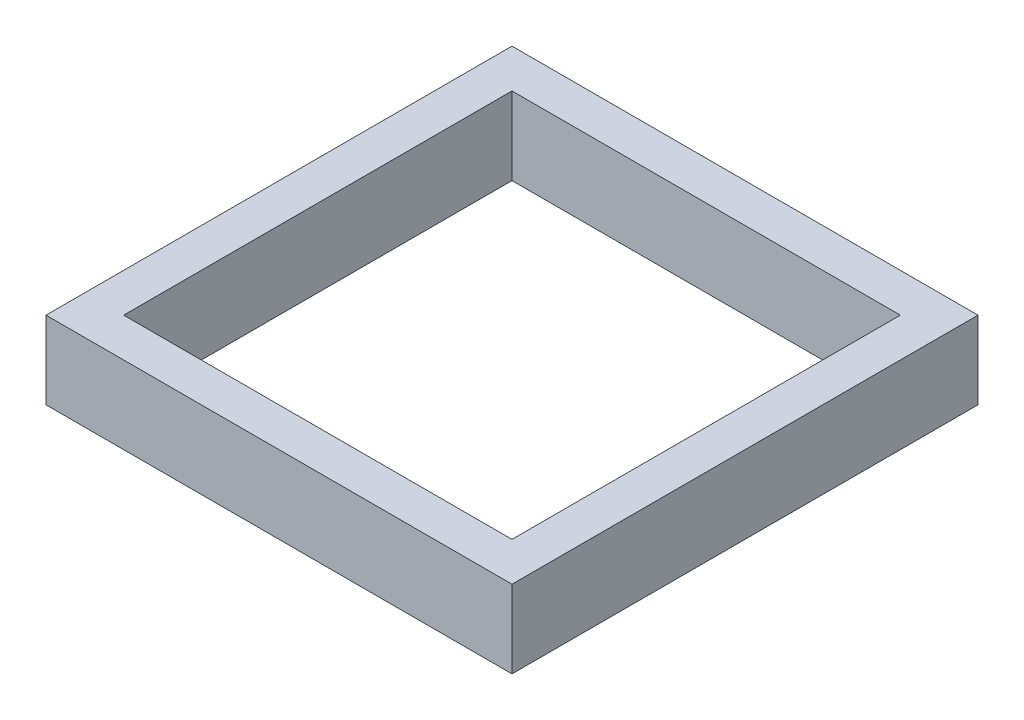
ISO-10303-21;
HEADER;
FILE_DESCRIPTION(('STEP AP214'),'2;1');
FILE_NAME('part.step','',(''),(''),'','','');
FILE_SCHEMA(('AUTOMOTIVE_DESIGN { 1 0 10303 214 1 1 1 1 }'));
ENDSEC;
DATA;
#1=APPLICATION_CONTEXT('core data for automotive mechanical design processes');
#2=APPLICATION_PROTOCOL_DEFINITION('international standard','automotive_design',2000,#1);
#3=PRODUCT_CONTEXT('',#1,'mechanical');
#4=PRODUCT('Part','Part','',(#3));
#5=PRODUCT_RELATED_PRODUCT_CATEGORY('part','',(#4));
#6=PRODUCT_DEFINITION_FORMATION('','',#4);
#7=PRODUCT_DEFINITION_CONTEXT('part definition',#1,'design');
#8=PRODUCT_DEFINITION('design','',#6,#7);
#9=PRODUCT_DEFINITION_SHAPE('','',#8);
#10=(LENGTH_UNIT() NAMED_UNIT(*) SI_UNIT(.MILLI.,.METRE.));
#11=(NAMED_UNIT(*) PLANE_ANGLE_UNIT() SI_UNIT($,.RADIAN.));
#12=(NAMED_UNIT(*) SI_UNIT($,.STERADIAN.) SOLID_ANGLE_UNIT());
#13=UNCERTAINTY_MEASURE_WITH_UNIT(LENGTH_MEASURE(1.E-05),#10,'distance_accuracy_value','');
#14=(GEOMETRIC_REPRESENTATION_CONTEXT(3) GLOBAL_UNCERTAINTY_ASSIGNED_CONTEXT((#13)) GLOBAL_UNIT_ASSIGNED_CONTEXT((#10,
#11,#12)) REPRESENTATION_CONTEXT('',''));
#15=CARTESIAN_POINT('',(0.,0.,0.));
#16=DIRECTION('',(0.,0.,1.));
#17=DIRECTION('',(1.,0.,0.));
#18=AXIS2_PLACEMENT_3D('',#15,#16,#17);
#19=CARTESIAN_POINT('',(-30.,10.,30.));
#20=DIRECTION('',(1.,0.,0.));
#21=DIRECTION('',(0.,0.,-1.));
#22=AXIS2_PLACEMENT_3D('',#19,#20,#21);
#23=PLANE('',#22);
#24=DIRECTION('',(0.,0.,1.));
#25=VECTOR('',#24,1.);
#26=CARTESIAN_POINT('',(-30.,0.,30.));
#27=LINE('',#26,#25);
#28=CARTESIAN_POINT('',(-30.,0.,-30.));
#29=VERTEX_POINT('',#28);
#30=CARTESIAN_POINT('',(-30.,0.,30.));
#31=VERTEX_POINT('',#30);
#32=EDGE_CURVE('E130',#29,#31,#27,.T.);
#33=ORIENTED_EDGE('',*,*,#32,.T.);
#34=DIRECTION('',(0.,-1.,0.));
#35=VECTOR('',#34,1.);
#36=CARTESIAN_POINT('',(-30.,10.,30.));
#37=LINE('',#36,#35);
#38=CARTESIAN_POINT('',(-30.,10.,30.));
#39=VERTEX_POINT('',#38);
#40=EDGE_CURVE('E11',#39,#31,#37,.T.);
#41=ORIENTED_EDGE('',*,*,#40,.F.);
#42=DIRECTION('',(0.,0.,1.));
#43=VECTOR('',#42,1.);
#44=CARTESIAN_POINT('',(-30.,10.,30.));
#45=LINE('',#44,#43);
#46=CARTESIAN_POINT('',(-30.,10.,-30.));
#47=VERTEX_POINT('',#46);
#48=EDGE_CURVE('E134',#47,#39,#45,.T.);
#49=ORIENTED_EDGE('',*,*,#48,.F.);
#50=DIRECTION('',(0.,-1.,0.));
#51=VECTOR('',#50,1.);
#52=CARTESIAN_POINT('',(-30.,10.,-30.));
#53=LINE('',#52,#51);
#54=EDGE_CURVE('E144',#47,#29,#53,.T.);
#55=ORIENTED_EDGE('',*,*,#54,.T.);
#56=EDGE_LOOP('',(#33,#41,#49,#55));
#57=FACE_BOUND('',#56,.T.);
#58=ADVANCED_FACE('F33',(#57),#23,.F.);
#59=CARTESIAN_POINT('',(30.,10.,30.));
#60=DIRECTION('',(0.,0.,-1.));
#61=DIRECTION('',(-1.,0.,0.));
#62=AXIS2_PLACEMENT_3D('',#59,#60,#61);
#63=PLANE('',#62);
#64=DIRECTION('',(1.,0.,0.));
#65=VECTOR('',#64,1.);
#66=CARTESIAN_POINT('',(30.,0.,30.));
#67=LINE('',#66,#65);
#68=CARTESIAN_POINT('',(30.,0.,30.));
#69=VERTEX_POINT('',#68);
#70=EDGE_CURVE('E147',#31,#69,#67,.T.);
#71=ORIENTED_EDGE('',*,*,#70,.T.);
#72=DIRECTION('',(0.,-1.,0.));
#73=VECTOR('',#72,1.);
#74=CARTESIAN_POINT('',(30.,10.,30.));
#75=LINE('',#74,#73);
#76=CARTESIAN_POINT('',(30.,10.,30.));
#77=VERTEX_POINT('',#76);
#78=EDGE_CURVE('E40',#77,#69,#75,.T.);
#79=ORIENTED_EDGE('',*,*,#78,.F.);
#80=DIRECTION('',(1.,0.,0.));
#81=VECTOR('',#80,1.);
#82=CARTESIAN_POINT('',(30.,10.,30.));
#83=LINE('',#82,#81);
#84=EDGE_CURVE('E137',#39,#77,#83,.T.);
#85=ORIENTED_EDGE('',*,*,#84,.F.);
#86=ORIENTED_EDGE('',*,*,#40,.T.);
#87=EDGE_LOOP('',(#71,#79,#85,#86));
#88=FACE_BOUND('',#87,.T.);
#89=ADVANCED_FACE('F175',(#88),#63,.F.);
#90=CARTESIAN_POINT('',(30.,10.,30.));
#91=DIRECTION('',(-1.,0.,0.));
#92=DIRECTION('',(0.,0.,1.));
#93=AXIS2_PLACEMENT_3D('',#90,#91,#92);
#94=PLANE('',#93);
#95=DIRECTION('',(0.,0.,-1.));
#96=VECTOR('',#95,1.);
#97=CARTESIAN_POINT('',(30.,0.,30.));
#98=LINE('',#97,#96);
#99=CARTESIAN_POINT('',(30.,0.,-30.));
#100=VERTEX_POINT('',#99);
#101=EDGE_CURVE('E149',#69,#100,#98,.T.);
#102=ORIENTED_EDGE('',*,*,#101,.T.);
#103=DIRECTION('',(0.,-1.,0.));
#104=VECTOR('',#103,1.);
#105=CARTESIAN_POINT('',(30.,10.,-30.));
#106=LINE('',#105,#104);
#107=CARTESIAN_POINT('',(30.,10.,-30.));
#108=VERTEX_POINT('',#107);
#109=EDGE_CURVE('E154',#108,#100,#106,.T.);
#110=ORIENTED_EDGE('',*,*,#109,.F.);
#111=DIRECTION('',(0.,0.,-1.));
#112=VECTOR('',#111,1.);
#113=CARTESIAN_POINT('',(30.,10.,30.));
#114=LINE('',#113,#112);
#115=EDGE_CURVE('E140',#77,#108,#114,.T.);
#116=ORIENTED_EDGE('',*,*,#115,.F.);
#117=ORIENTED_EDGE('',*,*,#78,.T.);
#118=EDGE_LOOP('',(#102,#110,#116,#117));
#119=FACE_BOUND('',#118,.T.);
#120=ADVANCED_FACE('F161',(#119),#94,.F.);
#121=CARTESIAN_POINT('',(30.,10.,-30.));
#122=DIRECTION('',(0.,0.,1.));
#123=DIRECTION('',(1.,0.,0.));
#124=AXIS2_PLACEMENT_3D('',#121,#122,#123);
#125=PLANE('',#124);
#126=DIRECTION('',(-1.,0.,0.));
#127=VECTOR('',#126,1.);
#128=CARTESIAN_POINT('',(30.,0.,-30.));
#129=LINE('',#128,#127);
#130=EDGE_CURVE('E138',#100,#29,#129,.T.);
#131=ORIENTED_EDGE('',*,*,#130,.T.);
#132=ORIENTED_EDGE('',*,*,#54,.F.);
#133=DIRECTION('',(-1.,0.,0.));
#134=VECTOR('',#133,1.);
#135=CARTESIAN_POINT('',(30.,10.,-30.));
#136=LINE('',#135,#134);
#137=EDGE_CURVE('E142',#108,#47,#136,.T.);
#138=ORIENTED_EDGE('',*,*,#137,.F.);
#139=ORIENTED_EDGE('',*,*,#109,.T.);
#140=EDGE_LOOP('',(#131,#132,#138,#139));
#141=FACE_BOUND('',#140,.T.);
#142=ADVANCED_FACE('F168',(#141),#125,.F.);
#143=CARTESIAN_POINT('',(0.,10.,0.));
#144=DIRECTION('',(0.,1.,0.));
#145=DIRECTION('',(0.,0.,1.));
#146=AXIS2_PLACEMENT_3D('',#143,#144,#145);
#147=PLANE('',#146);
#148=DIRECTION('',(0.,0.,1.));
#149=VECTOR('',#148,1.);
#150=CARTESIAN_POINT('',(-25.,10.,25.));
#151=LINE('',#150,#149);
#152=CARTESIAN_POINT('',(-25.,10.,-25.));
#153=VERTEX_POINT('',#152);
#154=CARTESIAN_POINT('',(-25.,10.,25.));
#155=VERTEX_POINT('',#154);
#156=EDGE_CURVE('E47',#153,#155,#151,.T.);
#157=ORIENTED_EDGE('',*,*,#156,.F.);
#158=DIRECTION('',(-1.,0.,0.));
#159=VECTOR('',#158,1.);
#160=CARTESIAN_POINT('',(25.,10.,-25.));
#161=LINE('',#160,#159);
#162=CARTESIAN_POINT('',(25.,10.,-25.));
#163=VERTEX_POINT('',#162);
#164=EDGE_CURVE('E115',#163,#153,#161,.T.);
#165=ORIENTED_EDGE('',*,*,#164,.F.);
#166=DIRECTION('',(0.,0.,-1.));
#167=VECTOR('',#166,1.);
#168=CARTESIAN_POINT('',(25.,10.,25.));
#169=LINE('',#168,#167);
#170=CARTESIAN_POINT('',(25.,10.,25.));
#171=VERTEX_POINT('',#170);
#172=EDGE_CURVE('E118',#171,#163,#169,.T.);
#173=ORIENTED_EDGE('',*,*,#172,.F.);
#174=DIRECTION('',(1.,0.,0.));
#175=VECTOR('',#174,1.);
#176=CARTESIAN_POINT('',(25.,10.,25.));
#177=LINE('',#176,#175);
#178=EDGE_CURVE('E124',#155,#171,#177,.T.);
#179=ORIENTED_EDGE('',*,*,#178,.F.);
#180=EDGE_LOOP('',(#157,#165,#173,#179));
#181=FACE_BOUND('',#180,.T.);
#182=ORIENTED_EDGE('',*,*,#48,.T.);
#183=ORIENTED_EDGE('',*,*,#84,.T.);
#184=ORIENTED_EDGE('',*,*,#115,.T.);
#185=ORIENTED_EDGE('',*,*,#137,.T.);
#186=EDGE_LOOP('',(#182,#183,#184,#185));
#187=FACE_BOUND('',#186,.T.);
#188=ADVANCED_FACE('F174',(#181,#187),#147,.T.);
#189=CARTESIAN_POINT('',(0.,0.,0.));
#190=DIRECTION('',(0.,1.,0.));
#191=DIRECTION('',(0.,0.,1.));
#192=AXIS2_PLACEMENT_3D('',#189,#190,#191);
#193=PLANE('',#192);
#194=DIRECTION('',(-1.,0.,0.));
#195=VECTOR('',#194,1.);
#196=CARTESIAN_POINT('',(25.,0.,-25.));
#197=LINE('',#196,#195);
#198=CARTESIAN_POINT('',(25.,0.,-25.));
#199=VERTEX_POINT('',#198);
#200=CARTESIAN_POINT('',(-25.,0.,-25.));
#201=VERTEX_POINT('',#200);
#202=EDGE_CURVE('E105',#199,#201,#197,.T.);
#203=ORIENTED_EDGE('',*,*,#202,.T.);
#204=DIRECTION('',(0.,0.,1.));
#205=VECTOR('',#204,1.);
#206=CARTESIAN_POINT('',(-25.,0.,25.));
#207=LINE('',#206,#205);
#208=CARTESIAN_POINT('',(-25.,0.,25.));
#209=VERTEX_POINT('',#208);
#210=EDGE_CURVE('E99',#201,#209,#207,.T.);
#211=ORIENTED_EDGE('',*,*,#210,.T.);
#212=DIRECTION('',(1.,0.,0.));
#213=VECTOR('',#212,1.);
#214=CARTESIAN_POINT('',(25.,0.,25.));
#215=LINE('',#214,#213);
#216=CARTESIAN_POINT('',(25.,0.,25.));
#217=VERTEX_POINT('',#216);
#218=EDGE_CURVE('E108',#209,#217,#215,.T.);
#219=ORIENTED_EDGE('',*,*,#218,.T.);
#220=DIRECTION('',(0.,0.,-1.));
#221=VECTOR('',#220,1.);
#222=CARTESIAN_POINT('',(25.,0.,25.));
#223=LINE('',#222,#221);
#224=EDGE_CURVE('E55',#217,#199,#223,.T.);
#225=ORIENTED_EDGE('',*,*,#224,.T.);
#226=EDGE_LOOP('',(#203,#211,#219,#225));
#227=FACE_BOUND('',#226,.T.);
#228=ORIENTED_EDGE('',*,*,#32,.F.);
#229=ORIENTED_EDGE('',*,*,#130,.F.);
#230=ORIENTED_EDGE('',*,*,#101,.F.);
#231=ORIENTED_EDGE('',*,*,#70,.F.);
#232=EDGE_LOOP('',(#228,#229,#230,#231));
#233=FACE_BOUND('',#232,.T.);
#234=ADVANCED_FACE('F112',(#227,#233),#193,.F.);
#235=CARTESIAN_POINT('',(-25.,0.,25.));
#236=DIRECTION('',(-1.,0.,0.));
#237=DIRECTION('',(0.,0.,1.));
#238=AXIS2_PLACEMENT_3D('',#235,#236,#237);
#239=PLANE('',#238);
#240=ORIENTED_EDGE('',*,*,#156,.T.);
#241=DIRECTION('',(0.,1.,0.));
#242=VECTOR('',#241,1.);
#243=CARTESIAN_POINT('',(-25.,0.,25.));
#244=LINE('',#243,#242);
#245=EDGE_CURVE('E95',#209,#155,#244,.T.);
#246=ORIENTED_EDGE('',*,*,#245,.F.);
#247=ORIENTED_EDGE('',*,*,#210,.F.);
#248=DIRECTION('',(0.,1.,0.));
#249=VECTOR('',#248,1.);
#250=CARTESIAN_POINT('',(-25.,0.,-25.));
#251=LINE('',#250,#249);
#252=EDGE_CURVE('E128',#201,#153,#251,.T.);
#253=ORIENTED_EDGE('',*,*,#252,.T.);
#254=EDGE_LOOP('',(#240,#246,#247,#253));
#255=FACE_BOUND('',#254,.T.);
#256=ADVANCED_FACE('F97',(#255),#239,.F.);
#257=CARTESIAN_POINT('',(25.,0.,-25.));
#258=DIRECTION('',(0.,0.,-1.));
#259=DIRECTION('',(-1.,0.,0.));
#260=AXIS2_PLACEMENT_3D('',#257,#258,#259);
#261=PLANE('',#260);
#262=ORIENTED_EDGE('',*,*,#164,.T.);
#263=ORIENTED_EDGE('',*,*,#252,.F.);
#264=ORIENTED_EDGE('',*,*,#202,.F.);
#265=DIRECTION('',(0.,1.,0.));
#266=VECTOR('',#265,1.);
#267=CARTESIAN_POINT('',(25.,0.,-25.));
#268=LINE('',#267,#266);
#269=EDGE_CURVE('E131',#199,#163,#268,.T.);
#270=ORIENTED_EDGE('',*,*,#269,.T.);
#271=EDGE_LOOP('',(#262,#263,#264,#270));
#272=FACE_BOUND('',#271,.T.);
#273=ADVANCED_FACE('F192',(#272),#261,.F.);
#274=CARTESIAN_POINT('',(25.,0.,25.));
#275=DIRECTION('',(1.,0.,0.));
#276=DIRECTION('',(0.,0.,-1.));
#277=AXIS2_PLACEMENT_3D('',#274,#275,#276);
#278=PLANE('',#277);
#279=ORIENTED_EDGE('',*,*,#172,.T.);
#280=ORIENTED_EDGE('',*,*,#269,.F.);
#281=ORIENTED_EDGE('',*,*,#224,.F.);
#282=DIRECTION('',(0.,1.,0.));
#283=VECTOR('',#282,1.);
#284=CARTESIAN_POINT('',(25.,0.,25.));
#285=LINE('',#284,#283);
#286=EDGE_CURVE('E104',#217,#171,#285,.T.);
#287=ORIENTED_EDGE('',*,*,#286,.T.);
#288=EDGE_LOOP('',(#279,#280,#281,#287));
#289=FACE_BOUND('',#288,.T.);
#290=ADVANCED_FACE('F195',(#289),#278,.F.);
#291=CARTESIAN_POINT('',(25.,0.,25.));
#292=DIRECTION('',(0.,0.,1.));
#293=DIRECTION('',(1.,0.,0.));
#294=AXIS2_PLACEMENT_3D('',#291,#292,#293);
#295=PLANE('',#294);
#296=ORIENTED_EDGE('',*,*,#178,.T.);
#297=ORIENTED_EDGE('',*,*,#286,.F.);
#298=ORIENTED_EDGE('',*,*,#218,.F.);
#299=ORIENTED_EDGE('',*,*,#245,.T.);
#300=EDGE_LOOP('',(#296,#297,#298,#299));
#301=FACE_BOUND('',#300,.T.);
#302=ADVANCED_FACE('F109',(#301),#295,.F.);
#303=CLOSED_SHELL('',(#58,#89,#120,#142,#188,#234,#256,#273,#290,#302));
#304=MANIFOLD_SOLID_BREP('B2',#303);
#305=ADVANCED_BREP_SHAPE_REPRESENTATION('',(#18,#304),#14);
#306=SHAPE_DEFINITION_REPRESENTATION(#9,#305);
ENDSEC;
END-ISO-10303-21;
